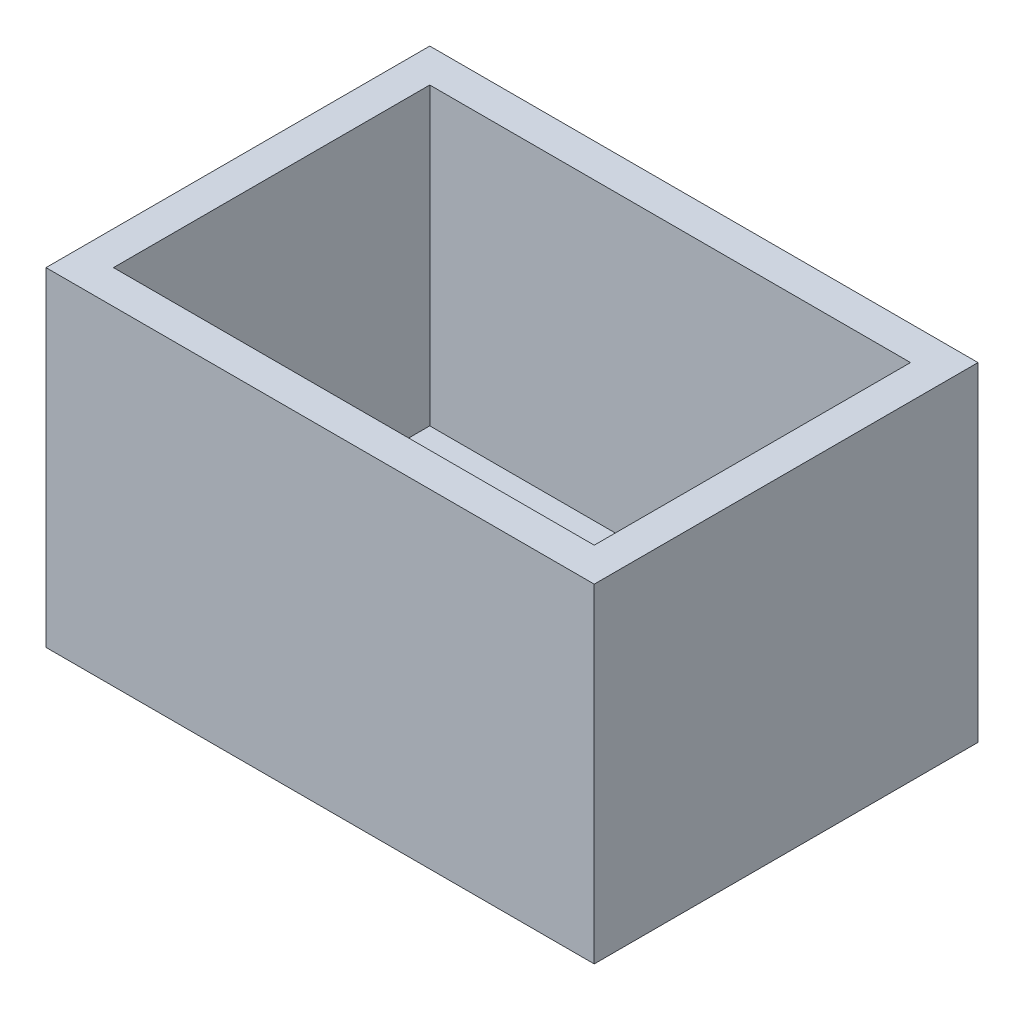
ISO-10303-21;
HEADER;
FILE_DESCRIPTION(('STEP AP214'),'2;1');
FILE_NAME('part.step','',(''),(''),'','','');
FILE_SCHEMA(('AUTOMOTIVE_DESIGN { 1 0 10303 214 1 1 1 1 }'));
ENDSEC;
DATA;
#1=APPLICATION_CONTEXT('core data for automotive mechanical design processes');
#2=APPLICATION_PROTOCOL_DEFINITION('international standard','automotive_design',2000,#1);
#3=PRODUCT_CONTEXT('',#1,'mechanical');
#4=PRODUCT('Part','Part','',(#3));
#5=PRODUCT_RELATED_PRODUCT_CATEGORY('part','',(#4));
#6=PRODUCT_DEFINITION_FORMATION('','',#4);
#7=PRODUCT_DEFINITION_CONTEXT('part definition',#1,'design');
#8=PRODUCT_DEFINITION('design','',#6,#7);
#9=PRODUCT_DEFINITION_SHAPE('','',#8);
#10=(LENGTH_UNIT() NAMED_UNIT(*) SI_UNIT(.MILLI.,.METRE.));
#11=(NAMED_UNIT(*) PLANE_ANGLE_UNIT() SI_UNIT($,.RADIAN.));
#12=(NAMED_UNIT(*) SI_UNIT($,.STERADIAN.) SOLID_ANGLE_UNIT());
#13=UNCERTAINTY_MEASURE_WITH_UNIT(LENGTH_MEASURE(1.E-05),#10,'distance_accuracy_value','');
#14=(GEOMETRIC_REPRESENTATION_CONTEXT(3) GLOBAL_UNCERTAINTY_ASSIGNED_CONTEXT((#13)) GLOBAL_UNIT_ASSIGNED_CONTEXT((#10,
#11,#12)) REPRESENTATION_CONTEXT('',''));
#15=CARTESIAN_POINT('',(0.,0.,0.));
#16=DIRECTION('',(0.,0.,1.));
#17=DIRECTION('',(1.,0.,0.));
#18=AXIS2_PLACEMENT_3D('',#15,#16,#17);
#19=CARTESIAN_POINT('',(16.25,19.5,-11.375));
#20=DIRECTION('',(-1.,0.,0.));
#21=DIRECTION('',(0.,0.,1.));
#22=AXIS2_PLACEMENT_3D('',#19,#20,#21);
#23=PLANE('',#22);
#24=DIRECTION('',(0.,0.,-1.));
#25=VECTOR('',#24,1.);
#26=CARTESIAN_POINT('',(16.25,0.,-11.375));
#27=LINE('',#26,#25);
#28=CARTESIAN_POINT('',(16.25,0.,11.375));
#29=VERTEX_POINT('',#28);
#30=CARTESIAN_POINT('',(16.25,0.,-11.375));
#31=VERTEX_POINT('',#30);
#32=EDGE_CURVE('E173',#29,#31,#27,.T.);
#33=ORIENTED_EDGE('',*,*,#32,.T.);
#34=DIRECTION('',(0.,-1.,0.));
#35=VECTOR('',#34,1.);
#36=CARTESIAN_POINT('',(16.25,19.5,-11.375));
#37=LINE('',#36,#35);
#38=CARTESIAN_POINT('',(16.25,19.5,-11.375));
#39=VERTEX_POINT('',#38);
#40=EDGE_CURVE('E11',#39,#31,#37,.T.);
#41=ORIENTED_EDGE('',*,*,#40,.F.);
#42=DIRECTION('',(0.,0.,-1.));
#43=VECTOR('',#42,1.);
#44=CARTESIAN_POINT('',(16.25,19.5,-11.375));
#45=LINE('',#44,#43);
#46=CARTESIAN_POINT('',(16.25,19.5,11.375));
#47=VERTEX_POINT('',#46);
#48=EDGE_CURVE('E162',#47,#39,#45,.T.);
#49=ORIENTED_EDGE('',*,*,#48,.F.);
#50=DIRECTION('',(0.,-1.,0.));
#51=VECTOR('',#50,1.);
#52=CARTESIAN_POINT('',(16.25,19.5,11.375));
#53=LINE('',#52,#51);
#54=EDGE_CURVE('E172',#47,#29,#53,.T.);
#55=ORIENTED_EDGE('',*,*,#54,.T.);
#56=EDGE_LOOP('',(#33,#41,#49,#55));
#57=FACE_BOUND('',#56,.T.);
#58=ADVANCED_FACE('F45',(#57),#23,.F.);
#59=CARTESIAN_POINT('',(-16.25,19.5,-11.375));
#60=DIRECTION('',(0.,0.,1.));
#61=DIRECTION('',(1.,0.,0.));
#62=AXIS2_PLACEMENT_3D('',#59,#60,#61);
#63=PLANE('',#62);
#64=DIRECTION('',(-1.,0.,0.));
#65=VECTOR('',#64,1.);
#66=CARTESIAN_POINT('',(-16.25,0.,-11.375));
#67=LINE('',#66,#65);
#68=CARTESIAN_POINT('',(-16.25,0.,-11.375));
#69=VERTEX_POINT('',#68);
#70=EDGE_CURVE('E177',#31,#69,#67,.T.);
#71=ORIENTED_EDGE('',*,*,#70,.T.);
#72=DIRECTION('',(0.,-1.,0.));
#73=VECTOR('',#72,1.);
#74=CARTESIAN_POINT('',(-16.25,19.5,-11.375));
#75=LINE('',#74,#73);
#76=CARTESIAN_POINT('',(-16.25,19.5,-11.375));
#77=VERTEX_POINT('',#76);
#78=EDGE_CURVE('E53',#77,#69,#75,.T.);
#79=ORIENTED_EDGE('',*,*,#78,.F.);
#80=DIRECTION('',(-1.,0.,0.));
#81=VECTOR('',#80,1.);
#82=CARTESIAN_POINT('',(-16.25,19.5,-11.375));
#83=LINE('',#82,#81);
#84=EDGE_CURVE('E97',#39,#77,#83,.T.);
#85=ORIENTED_EDGE('',*,*,#84,.F.);
#86=ORIENTED_EDGE('',*,*,#40,.T.);
#87=EDGE_LOOP('',(#71,#79,#85,#86));
#88=FACE_BOUND('',#87,.T.);
#89=ADVANCED_FACE('F213',(#88),#63,.F.);
#90=CARTESIAN_POINT('',(-16.25,19.5,-11.375));
#91=DIRECTION('',(1.,0.,0.));
#92=DIRECTION('',(0.,0.,-1.));
#93=AXIS2_PLACEMENT_3D('',#90,#91,#92);
#94=PLANE('',#93);
#95=DIRECTION('',(0.,0.,1.));
#96=VECTOR('',#95,1.);
#97=CARTESIAN_POINT('',(-16.25,0.,-11.375));
#98=LINE('',#97,#96);
#99=CARTESIAN_POINT('',(-16.25,0.,11.375));
#100=VERTEX_POINT('',#99);
#101=EDGE_CURVE('E180',#69,#100,#98,.T.);
#102=ORIENTED_EDGE('',*,*,#101,.T.);
#103=DIRECTION('',(0.,-1.,0.));
#104=VECTOR('',#103,1.);
#105=CARTESIAN_POINT('',(-16.25,19.5,11.375));
#106=LINE('',#105,#104);
#107=CARTESIAN_POINT('',(-16.25,19.5,11.375));
#108=VERTEX_POINT('',#107);
#109=EDGE_CURVE('E187',#108,#100,#106,.T.);
#110=ORIENTED_EDGE('',*,*,#109,.F.);
#111=DIRECTION('',(0.,0.,1.));
#112=VECTOR('',#111,1.);
#113=CARTESIAN_POINT('',(-16.25,19.5,-11.375));
#114=LINE('',#113,#112);
#115=EDGE_CURVE('E167',#77,#108,#114,.T.);
#116=ORIENTED_EDGE('',*,*,#115,.F.);
#117=ORIENTED_EDGE('',*,*,#78,.T.);
#118=EDGE_LOOP('',(#102,#110,#116,#117));
#119=FACE_BOUND('',#118,.T.);
#120=ADVANCED_FACE('F194',(#119),#94,.F.);
#121=CARTESIAN_POINT('',(-16.25,19.5,11.375));
#122=DIRECTION('',(0.,0.,-1.));
#123=DIRECTION('',(-1.,0.,0.));
#124=AXIS2_PLACEMENT_3D('',#121,#122,#123);
#125=PLANE('',#124);
#126=DIRECTION('',(1.,0.,0.));
#127=VECTOR('',#126,1.);
#128=CARTESIAN_POINT('',(-16.25,0.,11.375));
#129=LINE('',#128,#127);
#130=EDGE_CURVE('E90',#100,#29,#129,.T.);
#131=ORIENTED_EDGE('',*,*,#130,.T.);
#132=ORIENTED_EDGE('',*,*,#54,.F.);
#133=DIRECTION('',(1.,0.,0.));
#134=VECTOR('',#133,1.);
#135=CARTESIAN_POINT('',(-16.25,19.5,11.375));
#136=LINE('',#135,#134);
#137=EDGE_CURVE('E69',#108,#47,#136,.T.);
#138=ORIENTED_EDGE('',*,*,#137,.F.);
#139=ORIENTED_EDGE('',*,*,#109,.T.);
#140=EDGE_LOOP('',(#131,#132,#138,#139));
#141=FACE_BOUND('',#140,.T.);
#142=ADVANCED_FACE('F202',(#141),#125,.F.);
#143=CARTESIAN_POINT('',(0.,19.5,0.));
#144=DIRECTION('',(0.,1.,0.));
#145=DIRECTION('',(0.,0.,1.));
#146=AXIS2_PLACEMENT_3D('',#143,#144,#145);
#147=PLANE('',#146);
#148=DIRECTION('',(0.,0.,-1.));
#149=VECTOR('',#148,1.);
#150=CARTESIAN_POINT('',(14.25,19.5,-11.375));
#151=LINE('',#150,#149);
#152=CARTESIAN_POINT('',(14.25,19.5,9.375));
#153=VERTEX_POINT('',#152);
#154=CARTESIAN_POINT('',(14.25,19.5,-9.375));
#155=VERTEX_POINT('',#154);
#156=EDGE_CURVE('E146',#153,#155,#151,.T.);
#157=ORIENTED_EDGE('',*,*,#156,.F.);
#158=DIRECTION('',(1.,0.,0.));
#159=VECTOR('',#158,1.);
#160=CARTESIAN_POINT('',(-16.25,19.5,9.375));
#161=LINE('',#160,#159);
#162=CARTESIAN_POINT('',(-14.25,19.5,9.375));
#163=VERTEX_POINT('',#162);
#164=EDGE_CURVE('E159',#163,#153,#161,.T.);
#165=ORIENTED_EDGE('',*,*,#164,.F.);
#166=DIRECTION('',(0.,0.,1.));
#167=VECTOR('',#166,1.);
#168=CARTESIAN_POINT('',(-14.25,19.5,-11.375));
#169=LINE('',#168,#167);
#170=CARTESIAN_POINT('',(-14.25,19.5,-9.375));
#171=VERTEX_POINT('',#170);
#172=EDGE_CURVE('E156',#171,#163,#169,.T.);
#173=ORIENTED_EDGE('',*,*,#172,.F.);
#174=DIRECTION('',(-1.,0.,0.));
#175=VECTOR('',#174,1.);
#176=CARTESIAN_POINT('',(-16.25,19.5,-9.375));
#177=LINE('',#176,#175);
#178=EDGE_CURVE('E135',#155,#171,#177,.T.);
#179=ORIENTED_EDGE('',*,*,#178,.F.);
#180=EDGE_LOOP('',(#157,#165,#173,#179));
#181=FACE_BOUND('',#180,.T.);
#182=ORIENTED_EDGE('',*,*,#48,.T.);
#183=ORIENTED_EDGE('',*,*,#84,.T.);
#184=ORIENTED_EDGE('',*,*,#115,.T.);
#185=ORIENTED_EDGE('',*,*,#137,.T.);
#186=EDGE_LOOP('',(#182,#183,#184,#185));
#187=FACE_BOUND('',#186,.T.);
#188=ADVANCED_FACE('F204',(#181,#187),#147,.T.);
#189=CARTESIAN_POINT('',(0.,0.,0.));
#190=DIRECTION('',(0.,1.,0.));
#191=DIRECTION('',(0.,0.,1.));
#192=AXIS2_PLACEMENT_3D('',#189,#190,#191);
#193=PLANE('',#192);
#194=ORIENTED_EDGE('',*,*,#32,.F.);
#195=ORIENTED_EDGE('',*,*,#130,.F.);
#196=ORIENTED_EDGE('',*,*,#101,.F.);
#197=ORIENTED_EDGE('',*,*,#70,.F.);
#198=EDGE_LOOP('',(#194,#195,#196,#197));
#199=FACE_BOUND('',#198,.T.);
#200=ADVANCED_FACE('F198',(#199),#193,.F.);
#201=CARTESIAN_POINT('',(14.25,19.5,-11.375));
#202=DIRECTION('',(-1.,0.,0.));
#203=DIRECTION('',(0.,0.,1.));
#204=AXIS2_PLACEMENT_3D('',#201,#202,#203);
#205=PLANE('',#204);
#206=DIRECTION('',(0.,0.,-1.));
#207=VECTOR('',#206,1.);
#208=CARTESIAN_POINT('',(14.25,2.,-11.375));
#209=LINE('',#208,#207);
#210=CARTESIAN_POINT('',(14.25,2.,9.375));
#211=VERTEX_POINT('',#210);
#212=CARTESIAN_POINT('',(14.25,2.,-9.375));
#213=VERTEX_POINT('',#212);
#214=EDGE_CURVE('E125',#211,#213,#209,.T.);
#215=ORIENTED_EDGE('',*,*,#214,.F.);
#216=DIRECTION('',(0.,-1.,0.));
#217=VECTOR('',#216,1.);
#218=CARTESIAN_POINT('',(14.25,19.5,9.37499999999999));
#219=LINE('',#218,#217);
#220=EDGE_CURVE('E150',#153,#211,#219,.T.);
#221=ORIENTED_EDGE('',*,*,#220,.F.);
#222=ORIENTED_EDGE('',*,*,#156,.T.);
#223=DIRECTION('',(0.,-1.,0.));
#224=VECTOR('',#223,1.);
#225=CARTESIAN_POINT('',(14.25,19.5,-9.375));
#226=LINE('',#225,#224);
#227=EDGE_CURVE('E139',#155,#213,#226,.T.);
#228=ORIENTED_EDGE('',*,*,#227,.T.);
#229=EDGE_LOOP('',(#215,#221,#222,#228));
#230=FACE_BOUND('',#229,.T.);
#231=ADVANCED_FACE('F247',(#230),#205,.T.);
#232=CARTESIAN_POINT('',(-16.25,19.5,-9.375));
#233=DIRECTION('',(0.,0.,1.));
#234=DIRECTION('',(1.,0.,0.));
#235=AXIS2_PLACEMENT_3D('',#232,#233,#234);
#236=PLANE('',#235);
#237=DIRECTION('',(-1.,0.,0.));
#238=VECTOR('',#237,1.);
#239=CARTESIAN_POINT('',(-16.25,2.,-9.375));
#240=LINE('',#239,#238);
#241=CARTESIAN_POINT('',(-14.25,2.,-9.375));
#242=VERTEX_POINT('',#241);
#243=EDGE_CURVE('E119',#213,#242,#240,.T.);
#244=ORIENTED_EDGE('',*,*,#243,.F.);
#245=ORIENTED_EDGE('',*,*,#227,.F.);
#246=ORIENTED_EDGE('',*,*,#178,.T.);
#247=DIRECTION('',(0.,-1.,0.));
#248=VECTOR('',#247,1.);
#249=CARTESIAN_POINT('',(-14.25,19.5,-9.375));
#250=LINE('',#249,#248);
#251=EDGE_CURVE('E132',#171,#242,#250,.T.);
#252=ORIENTED_EDGE('',*,*,#251,.T.);
#253=EDGE_LOOP('',(#244,#245,#246,#252));
#254=FACE_BOUND('',#253,.T.);
#255=ADVANCED_FACE('F133',(#254),#236,.T.);
#256=CARTESIAN_POINT('',(-14.25,19.5,-11.375));
#257=DIRECTION('',(1.,0.,0.));
#258=DIRECTION('',(0.,0.,-1.));
#259=AXIS2_PLACEMENT_3D('',#256,#257,#258);
#260=PLANE('',#259);
#261=DIRECTION('',(0.,0.,1.));
#262=VECTOR('',#261,1.);
#263=CARTESIAN_POINT('',(-14.25,2.,-11.375));
#264=LINE('',#263,#262);
#265=CARTESIAN_POINT('',(-14.25,2.,9.375));
#266=VERTEX_POINT('',#265);
#267=EDGE_CURVE('E123',#242,#266,#264,.T.);
#268=ORIENTED_EDGE('',*,*,#267,.F.);
#269=ORIENTED_EDGE('',*,*,#251,.F.);
#270=ORIENTED_EDGE('',*,*,#172,.T.);
#271=DIRECTION('',(0.,-1.,0.));
#272=VECTOR('',#271,1.);
#273=CARTESIAN_POINT('',(-14.25,19.5,9.375));
#274=LINE('',#273,#272);
#275=EDGE_CURVE('E60',#163,#266,#274,.T.);
#276=ORIENTED_EDGE('',*,*,#275,.T.);
#277=EDGE_LOOP('',(#268,#269,#270,#276));
#278=FACE_BOUND('',#277,.T.);
#279=ADVANCED_FACE('F141',(#278),#260,.T.);
#280=CARTESIAN_POINT('',(-16.25,19.5,9.375));
#281=DIRECTION('',(0.,0.,-1.));
#282=DIRECTION('',(-1.,0.,0.));
#283=AXIS2_PLACEMENT_3D('',#280,#281,#282);
#284=PLANE('',#283);
#285=DIRECTION('',(1.,0.,0.));
#286=VECTOR('',#285,1.);
#287=CARTESIAN_POINT('',(-16.25,2.,9.375));
#288=LINE('',#287,#286);
#289=EDGE_CURVE('E143',#266,#211,#288,.T.);
#290=ORIENTED_EDGE('',*,*,#289,.F.);
#291=ORIENTED_EDGE('',*,*,#275,.F.);
#292=ORIENTED_EDGE('',*,*,#164,.T.);
#293=ORIENTED_EDGE('',*,*,#220,.T.);
#294=EDGE_LOOP('',(#290,#291,#292,#293));
#295=FACE_BOUND('',#294,.T.);
#296=ADVANCED_FACE('F271',(#295),#284,.T.);
#297=CARTESIAN_POINT('',(0.,2.,0.));
#298=DIRECTION('',(0.,1.,0.));
#299=DIRECTION('',(0.,0.,1.));
#300=AXIS2_PLACEMENT_3D('',#297,#298,#299);
#301=PLANE('',#300);
#302=ORIENTED_EDGE('',*,*,#214,.T.);
#303=ORIENTED_EDGE('',*,*,#243,.T.);
#304=ORIENTED_EDGE('',*,*,#267,.T.);
#305=ORIENTED_EDGE('',*,*,#289,.T.);
#306=EDGE_LOOP('',(#302,#303,#304,#305));
#307=FACE_BOUND('',#306,.T.);
#308=ADVANCED_FACE('F121',(#307),#301,.T.);
#309=CLOSED_SHELL('',(#58,#89,#120,#142,#188,#200,#231,#255,#279,#296,#308));
#310=MANIFOLD_SOLID_BREP('B2',#309);
#311=ADVANCED_BREP_SHAPE_REPRESENTATION('',(#18,#310),#14);
#312=SHAPE_DEFINITION_REPRESENTATION(#9,#311);
ENDSEC;
END-ISO-10303-21;
